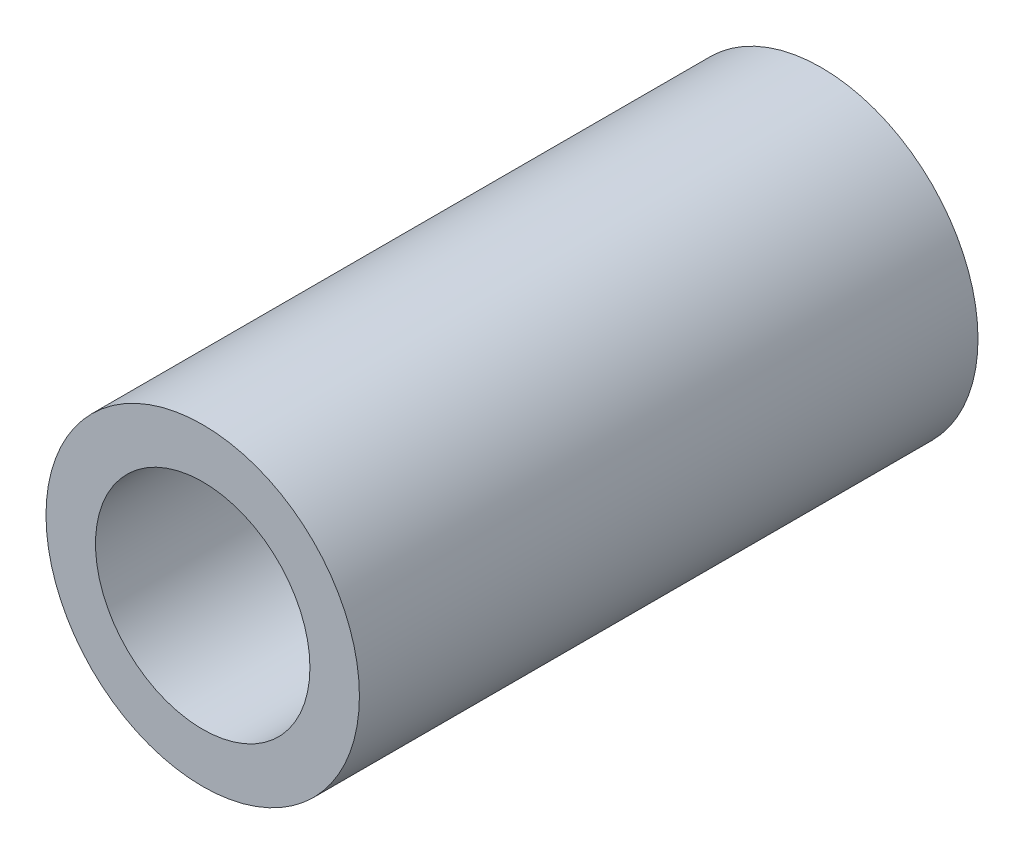
ISO-10303-21;
HEADER;
FILE_DESCRIPTION(('STEP AP214'),'2;1');
FILE_NAME('part.step','',(''),(''),'','','');
FILE_SCHEMA(('AUTOMOTIVE_DESIGN { 1 0 10303 214 1 1 1 1 }'));
ENDSEC;
DATA;
#1=APPLICATION_CONTEXT('core data for automotive mechanical design processes');
#2=APPLICATION_PROTOCOL_DEFINITION('international standard','automotive_design',2000,#1);
#3=PRODUCT_CONTEXT('',#1,'mechanical');
#4=PRODUCT('Part','Part','',(#3));
#5=PRODUCT_RELATED_PRODUCT_CATEGORY('part','',(#4));
#6=PRODUCT_DEFINITION_FORMATION('','',#4);
#7=PRODUCT_DEFINITION_CONTEXT('part definition',#1,'design');
#8=PRODUCT_DEFINITION('design','',#6,#7);
#9=PRODUCT_DEFINITION_SHAPE('','',#8);
#10=(LENGTH_UNIT() NAMED_UNIT(*) SI_UNIT(.MILLI.,.METRE.));
#11=(NAMED_UNIT(*) PLANE_ANGLE_UNIT() SI_UNIT($,.RADIAN.));
#12=(NAMED_UNIT(*) SI_UNIT($,.STERADIAN.) SOLID_ANGLE_UNIT());
#13=UNCERTAINTY_MEASURE_WITH_UNIT(LENGTH_MEASURE(1.E-05),#10,'distance_accuracy_value','');
#14=(GEOMETRIC_REPRESENTATION_CONTEXT(3) GLOBAL_UNCERTAINTY_ASSIGNED_CONTEXT((#13)) GLOBAL_UNIT_ASSIGNED_CONTEXT((#10,
#11,#12)) REPRESENTATION_CONTEXT('',''));
#15=CARTESIAN_POINT('',(0.,0.,0.));
#16=DIRECTION('',(0.,0.,1.));
#17=DIRECTION('',(1.,0.,0.));
#18=AXIS2_PLACEMENT_3D('',#15,#16,#17);
#19=CARTESIAN_POINT('',(-72.6767723472488,18.2388068534284,15.));
#20=DIRECTION('',(0.,0.,1.));
#21=DIRECTION('',(1.,0.,0.));
#22=AXIS2_PLACEMENT_3D('',#19,#20,#21);
#23=PLANE('',#22);
#24=CARTESIAN_POINT('',(-72.6767723472488,18.2388068534284,15.));
#25=DIRECTION('',(0.,0.,1.));
#26=DIRECTION('',(1.,0.,0.));
#27=AXIS2_PLACEMENT_3D('',#24,#25,#26);
#28=CIRCLE('',#27,3.8);
#29=CARTESIAN_POINT('',(-68.8767723472488,18.2388068534284,15.));
#30=VERTEX_POINT('',#29);
#31=EDGE_CURVE('E10',#30,#30,#28,.T.);
#32=ORIENTED_EDGE('',*,*,#31,.T.);
#33=EDGE_LOOP('',(#32));
#34=FACE_BOUND('',#33,.T.);
#35=CARTESIAN_POINT('',(-72.6767723472488,18.2388068534284,15.));
#36=DIRECTION('',(0.,0.,1.));
#37=DIRECTION('',(1.,0.,0.));
#38=AXIS2_PLACEMENT_3D('',#35,#36,#37);
#39=CIRCLE('',#38,2.6);
#40=CARTESIAN_POINT('',(-70.0767723472488,18.2388068534284,15.));
#41=VERTEX_POINT('',#40);
#42=EDGE_CURVE('E42',#41,#41,#39,.T.);
#43=ORIENTED_EDGE('',*,*,#42,.F.);
#44=EDGE_LOOP('',(#43));
#45=FACE_BOUND('',#44,.T.);
#46=ADVANCED_FACE('F31',(#34,#45),#23,.T.);
#47=CARTESIAN_POINT('',(-72.6767723472488,18.2388068534284,0.));
#48=DIRECTION('',(0.,0.,1.));
#49=DIRECTION('',(1.,0.,0.));
#50=AXIS2_PLACEMENT_3D('',#47,#48,#49);
#51=PLANE('',#50);
#52=CARTESIAN_POINT('',(-72.6767723472488,18.2388068534284,0.));
#53=DIRECTION('',(0.,0.,1.));
#54=DIRECTION('',(1.,0.,0.));
#55=AXIS2_PLACEMENT_3D('',#52,#53,#54);
#56=CIRCLE('',#55,3.8);
#57=CARTESIAN_POINT('',(-68.8767723472488,18.2388068534284,0.));
#58=VERTEX_POINT('',#57);
#59=EDGE_CURVE('E35',#58,#58,#56,.T.);
#60=ORIENTED_EDGE('',*,*,#59,.F.);
#61=EDGE_LOOP('',(#60));
#62=FACE_BOUND('',#61,.T.);
#63=CARTESIAN_POINT('',(-72.6767723472488,18.2388068534284,0.));
#64=DIRECTION('',(0.,0.,1.));
#65=DIRECTION('',(1.,0.,0.));
#66=AXIS2_PLACEMENT_3D('',#63,#64,#65);
#67=CIRCLE('',#66,2.6);
#68=CARTESIAN_POINT('',(-70.0767723472488,18.2388068534284,0.));
#69=VERTEX_POINT('',#68);
#70=EDGE_CURVE('E44',#69,#69,#67,.T.);
#71=ORIENTED_EDGE('',*,*,#70,.T.);
#72=EDGE_LOOP('',(#71));
#73=FACE_BOUND('',#72,.T.);
#74=ADVANCED_FACE('F54',(#62,#73),#51,.F.);
#75=CARTESIAN_POINT('',(-72.6767723472488,18.2388068534284,15.));
#76=DIRECTION('',(0.,0.,-1.));
#77=DIRECTION('',(-1.,0.,0.));
#78=AXIS2_PLACEMENT_3D('',#75,#76,#77);
#79=CYLINDRICAL_SURFACE('',#78,3.8);
#80=ORIENTED_EDGE('',*,*,#31,.F.);
#81=EDGE_LOOP('',(#80));
#82=FACE_BOUND('',#81,.T.);
#83=ORIENTED_EDGE('',*,*,#59,.T.);
#84=EDGE_LOOP('',(#83));
#85=FACE_BOUND('',#84,.T.);
#86=ADVANCED_FACE('F33',(#82,#85),#79,.T.);
#87=CARTESIAN_POINT('',(-72.6767723472488,18.2388068534284,15.));
#88=DIRECTION('',(0.,0.,-1.));
#89=DIRECTION('',(-1.,0.,0.));
#90=AXIS2_PLACEMENT_3D('',#87,#88,#89);
#91=CYLINDRICAL_SURFACE('',#90,2.6);
#92=ORIENTED_EDGE('',*,*,#42,.T.);
#93=EDGE_LOOP('',(#92));
#94=FACE_BOUND('',#93,.T.);
#95=ORIENTED_EDGE('',*,*,#70,.F.);
#96=EDGE_LOOP('',(#95));
#97=FACE_BOUND('',#96,.T.);
#98=ADVANCED_FACE('F50',(#94,#97),#91,.F.);
#99=CLOSED_SHELL('',(#46,#74,#86,#98));
#100=MANIFOLD_SOLID_BREP('B2',#99);
#101=ADVANCED_BREP_SHAPE_REPRESENTATION('',(#18,#100),#14);
#102=SHAPE_DEFINITION_REPRESENTATION(#9,#101);
ENDSEC;
END-ISO-10303-21;
